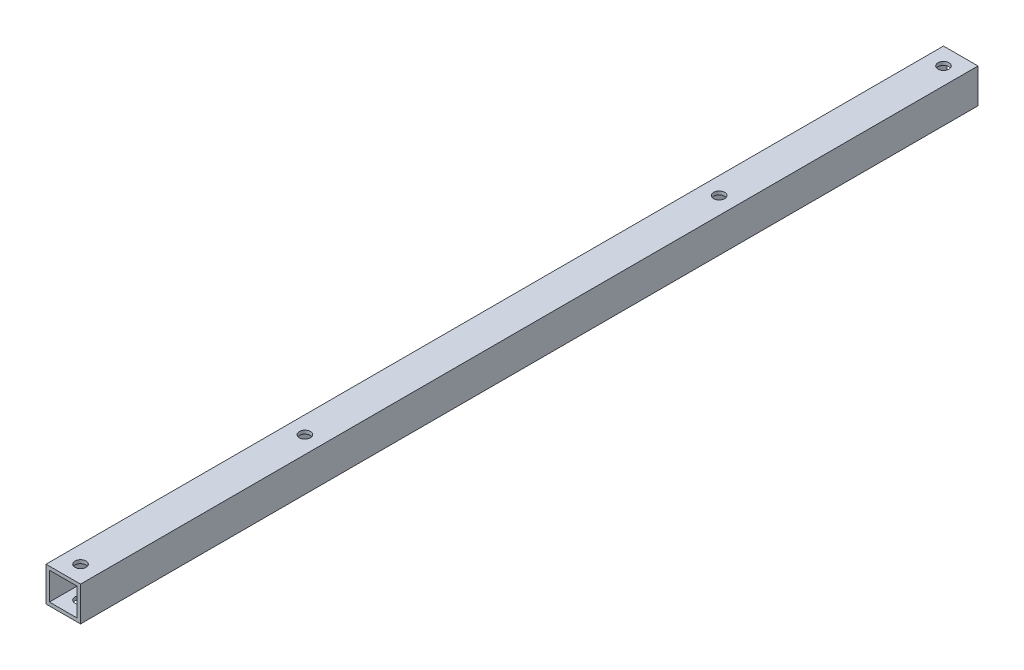
ISO-10303-21;
HEADER;
FILE_DESCRIPTION(('STEP AP214'),'2;1');
FILE_NAME('part.step','',(''),(''),'','','');
FILE_SCHEMA(('AUTOMOTIVE_DESIGN { 1 0 10303 214 1 1 1 1 }'));
ENDSEC;
DATA;
#1=APPLICATION_CONTEXT('core data for automotive mechanical design processes');
#2=APPLICATION_PROTOCOL_DEFINITION('international standard','automotive_design',2000,#1);
#3=PRODUCT_CONTEXT('',#1,'mechanical');
#4=PRODUCT('Part','Part','',(#3));
#5=PRODUCT_RELATED_PRODUCT_CATEGORY('part','',(#4));
#6=PRODUCT_DEFINITION_FORMATION('','',#4);
#7=PRODUCT_DEFINITION_CONTEXT('part definition',#1,'design');
#8=PRODUCT_DEFINITION('design','',#6,#7);
#9=PRODUCT_DEFINITION_SHAPE('','',#8);
#10=(LENGTH_UNIT() NAMED_UNIT(*) SI_UNIT(.MILLI.,.METRE.));
#11=(NAMED_UNIT(*) PLANE_ANGLE_UNIT() SI_UNIT($,.RADIAN.));
#12=(NAMED_UNIT(*) SI_UNIT($,.STERADIAN.) SOLID_ANGLE_UNIT());
#13=UNCERTAINTY_MEASURE_WITH_UNIT(LENGTH_MEASURE(1.E-05),#10,'distance_accuracy_value','');
#14=(GEOMETRIC_REPRESENTATION_CONTEXT(3) GLOBAL_UNCERTAINTY_ASSIGNED_CONTEXT((#13)) GLOBAL_UNIT_ASSIGNED_CONTEXT((#10,
#11,#12)) REPRESENTATION_CONTEXT('',''));
#15=CARTESIAN_POINT('',(0.,0.,0.));
#16=DIRECTION('',(0.,0.,1.));
#17=DIRECTION('',(1.,0.,0.));
#18=AXIS2_PLACEMENT_3D('',#15,#16,#17);
#19=CARTESIAN_POINT('',(0.,0.,260.));
#20=DIRECTION('',(0.,0.,1.));
#21=DIRECTION('',(1.,0.,0.));
#22=AXIS2_PLACEMENT_3D('',#19,#20,#21);
#23=PLANE('',#22);
#24=DIRECTION('',(0.,1.,0.));
#25=VECTOR('',#24,1.);
#26=CARTESIAN_POINT('',(5.,-5.,260.));
#27=LINE('',#26,#25);
#28=CARTESIAN_POINT('',(5.,-5.,260.));
#29=VERTEX_POINT('',#28);
#30=CARTESIAN_POINT('',(5.,5.,260.));
#31=VERTEX_POINT('',#30);
#32=EDGE_CURVE('E164',#29,#31,#27,.T.);
#33=ORIENTED_EDGE('',*,*,#32,.T.);
#34=DIRECTION('',(-1.,0.,0.));
#35=VECTOR('',#34,1.);
#36=CARTESIAN_POINT('',(-5.,5.,260.));
#37=LINE('',#36,#35);
#38=CARTESIAN_POINT('',(-5.,5.,260.));
#39=VERTEX_POINT('',#38);
#40=EDGE_CURVE('E167',#31,#39,#37,.T.);
#41=ORIENTED_EDGE('',*,*,#40,.T.);
#42=DIRECTION('',(0.,-1.,0.));
#43=VECTOR('',#42,1.);
#44=CARTESIAN_POINT('',(-5.,-5.,260.));
#45=LINE('',#44,#43);
#46=CARTESIAN_POINT('',(-5.,-5.,260.));
#47=VERTEX_POINT('',#46);
#48=EDGE_CURVE('E170',#39,#47,#45,.T.);
#49=ORIENTED_EDGE('',*,*,#48,.T.);
#50=DIRECTION('',(1.,0.,0.));
#51=VECTOR('',#50,1.);
#52=CARTESIAN_POINT('',(-5.,-5.,260.));
#53=LINE('',#52,#51);
#54=EDGE_CURVE('E172',#47,#29,#53,.T.);
#55=ORIENTED_EDGE('',*,*,#54,.T.);
#56=EDGE_LOOP('',(#33,#41,#49,#55));
#57=FACE_BOUND('',#56,.T.);
#58=DIRECTION('',(-1.,0.,0.));
#59=VECTOR('',#58,1.);
#60=CARTESIAN_POINT('',(0.,4.,260.));
#61=LINE('',#60,#59);
#62=CARTESIAN_POINT('',(4.,4.,260.));
#63=VERTEX_POINT('',#62);
#64=CARTESIAN_POINT('',(-4.,4.,260.));
#65=VERTEX_POINT('',#64);
#66=EDGE_CURVE('E134',#63,#65,#61,.T.);
#67=ORIENTED_EDGE('',*,*,#66,.F.);
#68=DIRECTION('',(0.,1.,0.));
#69=VECTOR('',#68,1.);
#70=CARTESIAN_POINT('',(4.,0.,260.));
#71=LINE('',#70,#69);
#72=CARTESIAN_POINT('',(4.,-4.,260.));
#73=VERTEX_POINT('',#72);
#74=EDGE_CURVE('E126',#73,#63,#71,.T.);
#75=ORIENTED_EDGE('',*,*,#74,.F.);
#76=DIRECTION('',(1.,0.,0.));
#77=VECTOR('',#76,1.);
#78=CARTESIAN_POINT('',(0.,-4.,260.));
#79=LINE('',#78,#77);
#80=CARTESIAN_POINT('',(-4.,-4.,260.));
#81=VERTEX_POINT('',#80);
#82=EDGE_CURVE('E148',#81,#73,#79,.T.);
#83=ORIENTED_EDGE('',*,*,#82,.F.);
#84=DIRECTION('',(0.,-1.,0.));
#85=VECTOR('',#84,1.);
#86=CARTESIAN_POINT('',(-4.,0.,260.));
#87=LINE('',#86,#85);
#88=EDGE_CURVE('E146',#65,#81,#87,.T.);
#89=ORIENTED_EDGE('',*,*,#88,.F.);
#90=EDGE_LOOP('',(#67,#75,#83,#89));
#91=FACE_BOUND('',#90,.T.);
#92=ADVANCED_FACE('F59',(#57,#91),#23,.T.);
#93=CARTESIAN_POINT('',(0.,0.,0.));
#94=DIRECTION('',(0.,0.,1.));
#95=DIRECTION('',(1.,0.,0.));
#96=AXIS2_PLACEMENT_3D('',#93,#94,#95);
#97=PLANE('',#96);
#98=DIRECTION('',(0.,1.,0.));
#99=VECTOR('',#98,1.);
#100=CARTESIAN_POINT('',(5.,-5.,0.));
#101=LINE('',#100,#99);
#102=CARTESIAN_POINT('',(5.,-5.,0.));
#103=VERTEX_POINT('',#102);
#104=CARTESIAN_POINT('',(5.,5.,0.));
#105=VERTEX_POINT('',#104);
#106=EDGE_CURVE('E142',#103,#105,#101,.T.);
#107=ORIENTED_EDGE('',*,*,#106,.F.);
#108=DIRECTION('',(1.,0.,0.));
#109=VECTOR('',#108,1.);
#110=CARTESIAN_POINT('',(-5.,-5.,0.));
#111=LINE('',#110,#109);
#112=CARTESIAN_POINT('',(-5.,-5.,0.));
#113=VERTEX_POINT('',#112);
#114=EDGE_CURVE('E168',#113,#103,#111,.T.);
#115=ORIENTED_EDGE('',*,*,#114,.F.);
#116=DIRECTION('',(0.,-1.,0.));
#117=VECTOR('',#116,1.);
#118=CARTESIAN_POINT('',(-5.,-5.,0.));
#119=LINE('',#118,#117);
#120=CARTESIAN_POINT('',(-5.,5.,0.));
#121=VERTEX_POINT('',#120);
#122=EDGE_CURVE('E179',#121,#113,#119,.T.);
#123=ORIENTED_EDGE('',*,*,#122,.F.);
#124=DIRECTION('',(-1.,0.,0.));
#125=VECTOR('',#124,1.);
#126=CARTESIAN_POINT('',(-5.,5.,0.));
#127=LINE('',#126,#125);
#128=EDGE_CURVE('E177',#105,#121,#127,.T.);
#129=ORIENTED_EDGE('',*,*,#128,.F.);
#130=EDGE_LOOP('',(#107,#115,#123,#129));
#131=FACE_BOUND('',#130,.T.);
#132=DIRECTION('',(0.,1.,0.));
#133=VECTOR('',#132,1.);
#134=CARTESIAN_POINT('',(4.,0.,0.));
#135=LINE('',#134,#133);
#136=CARTESIAN_POINT('',(4.,-4.,0.));
#137=VERTEX_POINT('',#136);
#138=CARTESIAN_POINT('',(4.,4.,0.));
#139=VERTEX_POINT('',#138);
#140=EDGE_CURVE('E84',#137,#139,#135,.T.);
#141=ORIENTED_EDGE('',*,*,#140,.T.);
#142=DIRECTION('',(-1.,0.,0.));
#143=VECTOR('',#142,1.);
#144=CARTESIAN_POINT('',(0.,4.,0.));
#145=LINE('',#144,#143);
#146=CARTESIAN_POINT('',(-4.,4.,0.));
#147=VERTEX_POINT('',#146);
#148=EDGE_CURVE('E141',#139,#147,#145,.T.);
#149=ORIENTED_EDGE('',*,*,#148,.T.);
#150=DIRECTION('',(0.,-1.,0.));
#151=VECTOR('',#150,1.);
#152=CARTESIAN_POINT('',(-4.,0.,0.));
#153=LINE('',#152,#151);
#154=CARTESIAN_POINT('',(-4.,-4.,0.));
#155=VERTEX_POINT('',#154);
#156=EDGE_CURVE('E156',#147,#155,#153,.T.);
#157=ORIENTED_EDGE('',*,*,#156,.T.);
#158=DIRECTION('',(1.,0.,0.));
#159=VECTOR('',#158,1.);
#160=CARTESIAN_POINT('',(0.,-4.,0.));
#161=LINE('',#160,#159);
#162=EDGE_CURVE('E135',#155,#137,#161,.T.);
#163=ORIENTED_EDGE('',*,*,#162,.T.);
#164=EDGE_LOOP('',(#141,#149,#157,#163));
#165=FACE_BOUND('',#164,.T.);
#166=ADVANCED_FACE('F231',(#131,#165),#97,.F.);
#167=CARTESIAN_POINT('',(5.,-5.,260.));
#168=DIRECTION('',(-1.,0.,0.));
#169=DIRECTION('',(0.,0.,1.));
#170=AXIS2_PLACEMENT_3D('',#167,#168,#169);
#171=PLANE('',#170);
#172=ORIENTED_EDGE('',*,*,#106,.T.);
#173=DIRECTION('',(0.,0.,-1.));
#174=VECTOR('',#173,1.);
#175=CARTESIAN_POINT('',(5.,5.,260.));
#176=LINE('',#175,#174);
#177=EDGE_CURVE('E12',#31,#105,#176,.T.);
#178=ORIENTED_EDGE('',*,*,#177,.F.);
#179=ORIENTED_EDGE('',*,*,#32,.F.);
#180=DIRECTION('',(0.,0.,-1.));
#181=VECTOR('',#180,1.);
#182=CARTESIAN_POINT('',(5.,-5.,260.));
#183=LINE('',#182,#181);
#184=EDGE_CURVE('E174',#29,#103,#183,.T.);
#185=ORIENTED_EDGE('',*,*,#184,.T.);
#186=EDGE_LOOP('',(#172,#178,#179,#185));
#187=FACE_BOUND('',#186,.T.);
#188=ADVANCED_FACE('F61',(#187),#171,.F.);
#189=CARTESIAN_POINT('',(-5.,5.,260.));
#190=DIRECTION('',(0.,-1.,0.));
#191=DIRECTION('',(0.,0.,-1.));
#192=AXIS2_PLACEMENT_3D('',#189,#190,#191);
#193=PLANE('',#192);
#194=CARTESIAN_POINT('',(0.,5.,5.));
#195=DIRECTION('',(0.,1.,0.));
#196=DIRECTION('',(0.,0.,1.));
#197=AXIS2_PLACEMENT_3D('',#194,#195,#196);
#198=CIRCLE('',#197,1.6);
#199=CARTESIAN_POINT('',(0.,5.,6.6));
#200=VERTEX_POINT('',#199);
#201=EDGE_CURVE('E267',#200,#200,#198,.T.);
#202=ORIENTED_EDGE('',*,*,#201,.F.);
#203=EDGE_LOOP('',(#202));
#204=FACE_BOUND('',#203,.T.);
#205=CARTESIAN_POINT('',(0.,5.,70.));
#206=DIRECTION('',(0.,1.,0.));
#207=DIRECTION('',(0.,0.,1.));
#208=AXIS2_PLACEMENT_3D('',#205,#206,#207);
#209=CIRCLE('',#208,1.6);
#210=CARTESIAN_POINT('',(0.,5.,71.6));
#211=VERTEX_POINT('',#210);
#212=EDGE_CURVE('E271',#211,#211,#209,.T.);
#213=ORIENTED_EDGE('',*,*,#212,.F.);
#214=EDGE_LOOP('',(#213));
#215=FACE_BOUND('',#214,.T.);
#216=CARTESIAN_POINT('',(0.,5.,190.));
#217=DIRECTION('',(0.,1.,0.));
#218=DIRECTION('',(0.,0.,-1.));
#219=AXIS2_PLACEMENT_3D('',#216,#217,#218);
#220=CIRCLE('',#219,1.6);
#221=CARTESIAN_POINT('',(0.,5.,188.4));
#222=VERTEX_POINT('',#221);
#223=EDGE_CURVE('E275',#222,#222,#220,.T.);
#224=ORIENTED_EDGE('',*,*,#223,.F.);
#225=EDGE_LOOP('',(#224));
#226=FACE_BOUND('',#225,.T.);
#227=CARTESIAN_POINT('',(0.,5.,255.));
#228=DIRECTION('',(0.,1.,0.));
#229=DIRECTION('',(0.,0.,-1.));
#230=AXIS2_PLACEMENT_3D('',#227,#228,#229);
#231=CIRCLE('',#230,1.6);
#232=CARTESIAN_POINT('',(0.,5.,253.4));
#233=VERTEX_POINT('',#232);
#234=EDGE_CURVE('E279',#233,#233,#231,.T.);
#235=ORIENTED_EDGE('',*,*,#234,.F.);
#236=EDGE_LOOP('',(#235));
#237=FACE_BOUND('',#236,.T.);
#238=ORIENTED_EDGE('',*,*,#128,.T.);
#239=DIRECTION('',(0.,0.,-1.));
#240=VECTOR('',#239,1.);
#241=CARTESIAN_POINT('',(-5.,5.,260.));
#242=LINE('',#241,#240);
#243=EDGE_CURVE('E68',#39,#121,#242,.T.);
#244=ORIENTED_EDGE('',*,*,#243,.F.);
#245=ORIENTED_EDGE('',*,*,#40,.F.);
#246=ORIENTED_EDGE('',*,*,#177,.T.);
#247=EDGE_LOOP('',(#238,#244,#245,#246));
#248=FACE_BOUND('',#247,.T.);
#249=ADVANCED_FACE('F256',(#204,#215,#226,#237,#248),#193,.F.);
#250=CARTESIAN_POINT('',(-5.,-5.,260.));
#251=DIRECTION('',(1.,0.,0.));
#252=DIRECTION('',(0.,0.,-1.));
#253=AXIS2_PLACEMENT_3D('',#250,#251,#252);
#254=PLANE('',#253);
#255=ORIENTED_EDGE('',*,*,#122,.T.);
#256=DIRECTION('',(0.,0.,-1.));
#257=VECTOR('',#256,1.);
#258=CARTESIAN_POINT('',(-5.,-5.,260.));
#259=LINE('',#258,#257);
#260=EDGE_CURVE('E184',#47,#113,#259,.T.);
#261=ORIENTED_EDGE('',*,*,#260,.F.);
#262=ORIENTED_EDGE('',*,*,#48,.F.);
#263=ORIENTED_EDGE('',*,*,#243,.T.);
#264=EDGE_LOOP('',(#255,#261,#262,#263));
#265=FACE_BOUND('',#264,.T.);
#266=ADVANCED_FACE('F253',(#265),#254,.F.);
#267=CARTESIAN_POINT('',(-5.,-5.,260.));
#268=DIRECTION('',(0.,1.,0.));
#269=DIRECTION('',(0.,0.,1.));
#270=AXIS2_PLACEMENT_3D('',#267,#268,#269);
#271=PLANE('',#270);
#272=CARTESIAN_POINT('',(0.,-5.,5.));
#273=DIRECTION('',(0.,1.,0.));
#274=DIRECTION('',(0.,0.,1.));
#275=AXIS2_PLACEMENT_3D('',#272,#273,#274);
#276=CIRCLE('',#275,1.6);
#277=CARTESIAN_POINT('',(0.,-5.,6.6));
#278=VERTEX_POINT('',#277);
#279=EDGE_CURVE('E193',#278,#278,#276,.T.);
#280=ORIENTED_EDGE('',*,*,#279,.T.);
#281=EDGE_LOOP('',(#280));
#282=FACE_BOUND('',#281,.T.);
#283=CARTESIAN_POINT('',(0.,-5.,70.));
#284=DIRECTION('',(0.,1.,0.));
#285=DIRECTION('',(0.,0.,1.));
#286=AXIS2_PLACEMENT_3D('',#283,#284,#285);
#287=CIRCLE('',#286,1.6);
#288=CARTESIAN_POINT('',(0.,-5.,71.6));
#289=VERTEX_POINT('',#288);
#290=EDGE_CURVE('E301',#289,#289,#287,.T.);
#291=ORIENTED_EDGE('',*,*,#290,.T.);
#292=EDGE_LOOP('',(#291));
#293=FACE_BOUND('',#292,.T.);
#294=CARTESIAN_POINT('',(0.,-5.,190.));
#295=DIRECTION('',(0.,1.,0.));
#296=DIRECTION('',(0.,0.,-1.));
#297=AXIS2_PLACEMENT_3D('',#294,#295,#296);
#298=CIRCLE('',#297,1.6);
#299=CARTESIAN_POINT('',(0.,-5.,188.4));
#300=VERTEX_POINT('',#299);
#301=EDGE_CURVE('E297',#300,#300,#298,.T.);
#302=ORIENTED_EDGE('',*,*,#301,.T.);
#303=EDGE_LOOP('',(#302));
#304=FACE_BOUND('',#303,.T.);
#305=CARTESIAN_POINT('',(0.,-5.,255.));
#306=DIRECTION('',(0.,1.,0.));
#307=DIRECTION('',(0.,0.,-1.));
#308=AXIS2_PLACEMENT_3D('',#305,#306,#307);
#309=CIRCLE('',#308,1.6);
#310=CARTESIAN_POINT('',(0.,-5.,253.4));
#311=VERTEX_POINT('',#310);
#312=EDGE_CURVE('E292',#311,#311,#309,.T.);
#313=ORIENTED_EDGE('',*,*,#312,.T.);
#314=EDGE_LOOP('',(#313));
#315=FACE_BOUND('',#314,.T.);
#316=ORIENTED_EDGE('',*,*,#114,.T.);
#317=ORIENTED_EDGE('',*,*,#184,.F.);
#318=ORIENTED_EDGE('',*,*,#54,.F.);
#319=ORIENTED_EDGE('',*,*,#260,.T.);
#320=EDGE_LOOP('',(#316,#317,#318,#319));
#321=FACE_BOUND('',#320,.T.);
#322=ADVANCED_FACE('F250',(#282,#293,#304,#315,#321),#271,.F.);
#323=CARTESIAN_POINT('',(4.,0.,260.));
#324=DIRECTION('',(-1.,0.,0.));
#325=DIRECTION('',(0.,0.,1.));
#326=AXIS2_PLACEMENT_3D('',#323,#324,#325);
#327=PLANE('',#326);
#328=ORIENTED_EDGE('',*,*,#140,.F.);
#329=DIRECTION('',(0.,0.,-1.));
#330=VECTOR('',#329,1.);
#331=CARTESIAN_POINT('',(4.,-4.,260.));
#332=LINE('',#331,#330);
#333=EDGE_CURVE('E130',#73,#137,#332,.T.);
#334=ORIENTED_EDGE('',*,*,#333,.F.);
#335=ORIENTED_EDGE('',*,*,#74,.T.);
#336=DIRECTION('',(0.,0.,-1.));
#337=VECTOR('',#336,1.);
#338=CARTESIAN_POINT('',(4.,4.,260.));
#339=LINE('',#338,#337);
#340=EDGE_CURVE('E129',#63,#139,#339,.T.);
#341=ORIENTED_EDGE('',*,*,#340,.T.);
#342=EDGE_LOOP('',(#328,#334,#335,#341));
#343=FACE_BOUND('',#342,.T.);
#344=ADVANCED_FACE('F128',(#343),#327,.T.);
#345=CARTESIAN_POINT('',(0.,4.,260.));
#346=DIRECTION('',(0.,-1.,0.));
#347=DIRECTION('',(0.,0.,-1.));
#348=AXIS2_PLACEMENT_3D('',#345,#346,#347);
#349=PLANE('',#348);
#350=CARTESIAN_POINT('',(0.,4.,5.));
#351=DIRECTION('',(0.,-1.,0.));
#352=DIRECTION('',(0.,0.,-1.));
#353=AXIS2_PLACEMENT_3D('',#350,#351,#352);
#354=CIRCLE('',#353,1.6);
#355=CARTESIAN_POINT('',(0.,4.,3.4));
#356=VERTEX_POINT('',#355);
#357=EDGE_CURVE('E154',#356,#356,#354,.T.);
#358=ORIENTED_EDGE('',*,*,#357,.F.);
#359=EDGE_LOOP('',(#358));
#360=FACE_BOUND('',#359,.T.);
#361=CARTESIAN_POINT('',(0.,4.,70.));
#362=DIRECTION('',(0.,-1.,0.));
#363=DIRECTION('',(0.,0.,-1.));
#364=AXIS2_PLACEMENT_3D('',#361,#362,#363);
#365=CIRCLE('',#364,1.6);
#366=CARTESIAN_POINT('',(0.,4.,68.4));
#367=VERTEX_POINT('',#366);
#368=EDGE_CURVE('E199',#367,#367,#365,.T.);
#369=ORIENTED_EDGE('',*,*,#368,.F.);
#370=EDGE_LOOP('',(#369));
#371=FACE_BOUND('',#370,.T.);
#372=CARTESIAN_POINT('',(0.,4.,190.));
#373=DIRECTION('',(0.,-1.,0.));
#374=DIRECTION('',(0.,0.,-1.));
#375=AXIS2_PLACEMENT_3D('',#372,#373,#374);
#376=CIRCLE('',#375,1.6);
#377=CARTESIAN_POINT('',(0.,4.,188.4));
#378=VERTEX_POINT('',#377);
#379=EDGE_CURVE('E196',#378,#378,#376,.T.);
#380=ORIENTED_EDGE('',*,*,#379,.F.);
#381=EDGE_LOOP('',(#380));
#382=FACE_BOUND('',#381,.T.);
#383=CARTESIAN_POINT('',(0.,4.,255.));
#384=DIRECTION('',(0.,-1.,0.));
#385=DIRECTION('',(0.,0.,-1.));
#386=AXIS2_PLACEMENT_3D('',#383,#384,#385);
#387=CIRCLE('',#386,1.6);
#388=CARTESIAN_POINT('',(0.,4.,253.4));
#389=VERTEX_POINT('',#388);
#390=EDGE_CURVE('E192',#389,#389,#387,.T.);
#391=ORIENTED_EDGE('',*,*,#390,.F.);
#392=EDGE_LOOP('',(#391));
#393=FACE_BOUND('',#392,.T.);
#394=ORIENTED_EDGE('',*,*,#148,.F.);
#395=ORIENTED_EDGE('',*,*,#340,.F.);
#396=ORIENTED_EDGE('',*,*,#66,.T.);
#397=DIRECTION('',(0.,0.,-1.));
#398=VECTOR('',#397,1.);
#399=CARTESIAN_POINT('',(-4.,4.,260.));
#400=LINE('',#399,#398);
#401=EDGE_CURVE('E143',#65,#147,#400,.T.);
#402=ORIENTED_EDGE('',*,*,#401,.T.);
#403=EDGE_LOOP('',(#394,#395,#396,#402));
#404=FACE_BOUND('',#403,.T.);
#405=ADVANCED_FACE('F138',(#360,#371,#382,#393,#404),#349,.T.);
#406=CARTESIAN_POINT('',(-4.,0.,260.));
#407=DIRECTION('',(1.,0.,0.));
#408=DIRECTION('',(0.,0.,-1.));
#409=AXIS2_PLACEMENT_3D('',#406,#407,#408);
#410=PLANE('',#409);
#411=ORIENTED_EDGE('',*,*,#156,.F.);
#412=ORIENTED_EDGE('',*,*,#401,.F.);
#413=ORIENTED_EDGE('',*,*,#88,.T.);
#414=DIRECTION('',(0.,0.,-1.));
#415=VECTOR('',#414,1.);
#416=CARTESIAN_POINT('',(-4.,-4.,260.));
#417=LINE('',#416,#415);
#418=EDGE_CURVE('E76',#81,#155,#417,.T.);
#419=ORIENTED_EDGE('',*,*,#418,.T.);
#420=EDGE_LOOP('',(#411,#412,#413,#419));
#421=FACE_BOUND('',#420,.T.);
#422=ADVANCED_FACE('F223',(#421),#410,.T.);
#423=CARTESIAN_POINT('',(0.,-4.,260.));
#424=DIRECTION('',(0.,1.,0.));
#425=DIRECTION('',(0.,0.,1.));
#426=AXIS2_PLACEMENT_3D('',#423,#424,#425);
#427=PLANE('',#426);
#428=CARTESIAN_POINT('',(0.,-4.,5.));
#429=DIRECTION('',(0.,1.,0.));
#430=DIRECTION('',(0.,0.,1.));
#431=AXIS2_PLACEMENT_3D('',#428,#429,#430);
#432=CIRCLE('',#431,1.6);
#433=CARTESIAN_POINT('',(0.,-4.,6.6));
#434=VERTEX_POINT('',#433);
#435=EDGE_CURVE('E63',#434,#434,#432,.T.);
#436=ORIENTED_EDGE('',*,*,#435,.F.);
#437=EDGE_LOOP('',(#436));
#438=FACE_BOUND('',#437,.T.);
#439=CARTESIAN_POINT('',(0.,-4.,70.));
#440=DIRECTION('',(0.,1.,0.));
#441=DIRECTION('',(0.,0.,1.));
#442=AXIS2_PLACEMENT_3D('',#439,#440,#441);
#443=CIRCLE('',#442,1.6);
#444=CARTESIAN_POINT('',(0.,-4.,71.6));
#445=VERTEX_POINT('',#444);
#446=EDGE_CURVE('E197',#445,#445,#443,.T.);
#447=ORIENTED_EDGE('',*,*,#446,.F.);
#448=EDGE_LOOP('',(#447));
#449=FACE_BOUND('',#448,.T.);
#450=CARTESIAN_POINT('',(0.,-4.,190.));
#451=DIRECTION('',(0.,1.,0.));
#452=DIRECTION('',(0.,0.,1.));
#453=AXIS2_PLACEMENT_3D('',#450,#451,#452);
#454=CIRCLE('',#453,1.6);
#455=CARTESIAN_POINT('',(0.,-4.,191.6));
#456=VERTEX_POINT('',#455);
#457=EDGE_CURVE('E194',#456,#456,#454,.T.);
#458=ORIENTED_EDGE('',*,*,#457,.F.);
#459=EDGE_LOOP('',(#458));
#460=FACE_BOUND('',#459,.T.);
#461=CARTESIAN_POINT('',(0.,-4.,255.));
#462=DIRECTION('',(0.,1.,0.));
#463=DIRECTION('',(0.,0.,1.));
#464=AXIS2_PLACEMENT_3D('',#461,#462,#463);
#465=CIRCLE('',#464,1.6);
#466=CARTESIAN_POINT('',(0.,-4.,256.6));
#467=VERTEX_POINT('',#466);
#468=EDGE_CURVE('E189',#467,#467,#465,.T.);
#469=ORIENTED_EDGE('',*,*,#468,.F.);
#470=EDGE_LOOP('',(#469));
#471=FACE_BOUND('',#470,.T.);
#472=ORIENTED_EDGE('',*,*,#162,.F.);
#473=ORIENTED_EDGE('',*,*,#418,.F.);
#474=ORIENTED_EDGE('',*,*,#82,.T.);
#475=ORIENTED_EDGE('',*,*,#333,.T.);
#476=EDGE_LOOP('',(#472,#473,#474,#475));
#477=FACE_BOUND('',#476,.T.);
#478=ADVANCED_FACE('F219',(#438,#449,#460,#471,#477),#427,.T.);
#479=CARTESIAN_POINT('',(0.,-5.,255.));
#480=DIRECTION('',(0.,1.,0.));
#481=DIRECTION('',(0.,0.,1.));
#482=AXIS2_PLACEMENT_3D('',#479,#480,#481);
#483=CYLINDRICAL_SURFACE('',#482,1.6);
#484=ORIENTED_EDGE('',*,*,#468,.T.);
#485=EDGE_LOOP('',(#484));
#486=FACE_BOUND('',#485,.T.);
#487=ORIENTED_EDGE('',*,*,#312,.F.);
#488=EDGE_LOOP('',(#487));
#489=FACE_BOUND('',#488,.T.);
#490=ADVANCED_FACE('F222',(#486,#489),#483,.F.);
#491=CARTESIAN_POINT('',(0.,-5.,190.));
#492=DIRECTION('',(0.,1.,0.));
#493=DIRECTION('',(0.,0.,1.));
#494=AXIS2_PLACEMENT_3D('',#491,#492,#493);
#495=CYLINDRICAL_SURFACE('',#494,1.6);
#496=ORIENTED_EDGE('',*,*,#457,.T.);
#497=EDGE_LOOP('',(#496));
#498=FACE_BOUND('',#497,.T.);
#499=ORIENTED_EDGE('',*,*,#301,.F.);
#500=EDGE_LOOP('',(#499));
#501=FACE_BOUND('',#500,.T.);
#502=ADVANCED_FACE('F320',(#498,#501),#495,.F.);
#503=CARTESIAN_POINT('',(0.,-5.,70.));
#504=DIRECTION('',(0.,1.,0.));
#505=DIRECTION('',(0.,0.,1.));
#506=AXIS2_PLACEMENT_3D('',#503,#504,#505);
#507=CYLINDRICAL_SURFACE('',#506,1.6);
#508=ORIENTED_EDGE('',*,*,#446,.T.);
#509=EDGE_LOOP('',(#508));
#510=FACE_BOUND('',#509,.T.);
#511=ORIENTED_EDGE('',*,*,#290,.F.);
#512=EDGE_LOOP('',(#511));
#513=FACE_BOUND('',#512,.T.);
#514=ADVANCED_FACE('F310',(#510,#513),#507,.F.);
#515=CARTESIAN_POINT('',(0.,-5.,5.));
#516=DIRECTION('',(0.,1.,0.));
#517=DIRECTION('',(0.,0.,1.));
#518=AXIS2_PLACEMENT_3D('',#515,#516,#517);
#519=CYLINDRICAL_SURFACE('',#518,1.6);
#520=ORIENTED_EDGE('',*,*,#435,.T.);
#521=EDGE_LOOP('',(#520));
#522=FACE_BOUND('',#521,.T.);
#523=ORIENTED_EDGE('',*,*,#279,.F.);
#524=EDGE_LOOP('',(#523));
#525=FACE_BOUND('',#524,.T.);
#526=ADVANCED_FACE('F216',(#522,#525),#519,.F.);
#527=ORIENTED_EDGE('',*,*,#390,.T.);
#528=EDGE_LOOP('',(#527));
#529=FACE_BOUND('',#528,.T.);
#530=ORIENTED_EDGE('',*,*,#234,.T.);
#531=EDGE_LOOP('',(#530));
#532=FACE_BOUND('',#531,.T.);
#533=ADVANCED_FACE('F309',(#529,#532),#483,.F.);
#534=ORIENTED_EDGE('',*,*,#379,.T.);
#535=EDGE_LOOP('',(#534));
#536=FACE_BOUND('',#535,.T.);
#537=ORIENTED_EDGE('',*,*,#223,.T.);
#538=EDGE_LOOP('',(#537));
#539=FACE_BOUND('',#538,.T.);
#540=ADVANCED_FACE('F317',(#536,#539),#495,.F.);
#541=ORIENTED_EDGE('',*,*,#368,.T.);
#542=EDGE_LOOP('',(#541));
#543=FACE_BOUND('',#542,.T.);
#544=ORIENTED_EDGE('',*,*,#212,.T.);
#545=EDGE_LOOP('',(#544));
#546=FACE_BOUND('',#545,.T.);
#547=ADVANCED_FACE('F322',(#543,#546),#507,.F.);
#548=ORIENTED_EDGE('',*,*,#357,.T.);
#549=EDGE_LOOP('',(#548));
#550=FACE_BOUND('',#549,.T.);
#551=ORIENTED_EDGE('',*,*,#201,.T.);
#552=EDGE_LOOP('',(#551));
#553=FACE_BOUND('',#552,.T.);
#554=ADVANCED_FACE('F312',(#550,#553),#519,.F.);
#555=CLOSED_SHELL('',(#92,#166,#188,#249,#266,#322,#344,#405,#422,#478,#490,#502,#514,#526,#533,
#540,#547,#554));
#556=MANIFOLD_SOLID_BREP('B2',#555);
#557=ADVANCED_BREP_SHAPE_REPRESENTATION('',(#18,#556),#14);
#558=SHAPE_DEFINITION_REPRESENTATION(#9,#557);
ENDSEC;
END-ISO-10303-21;
